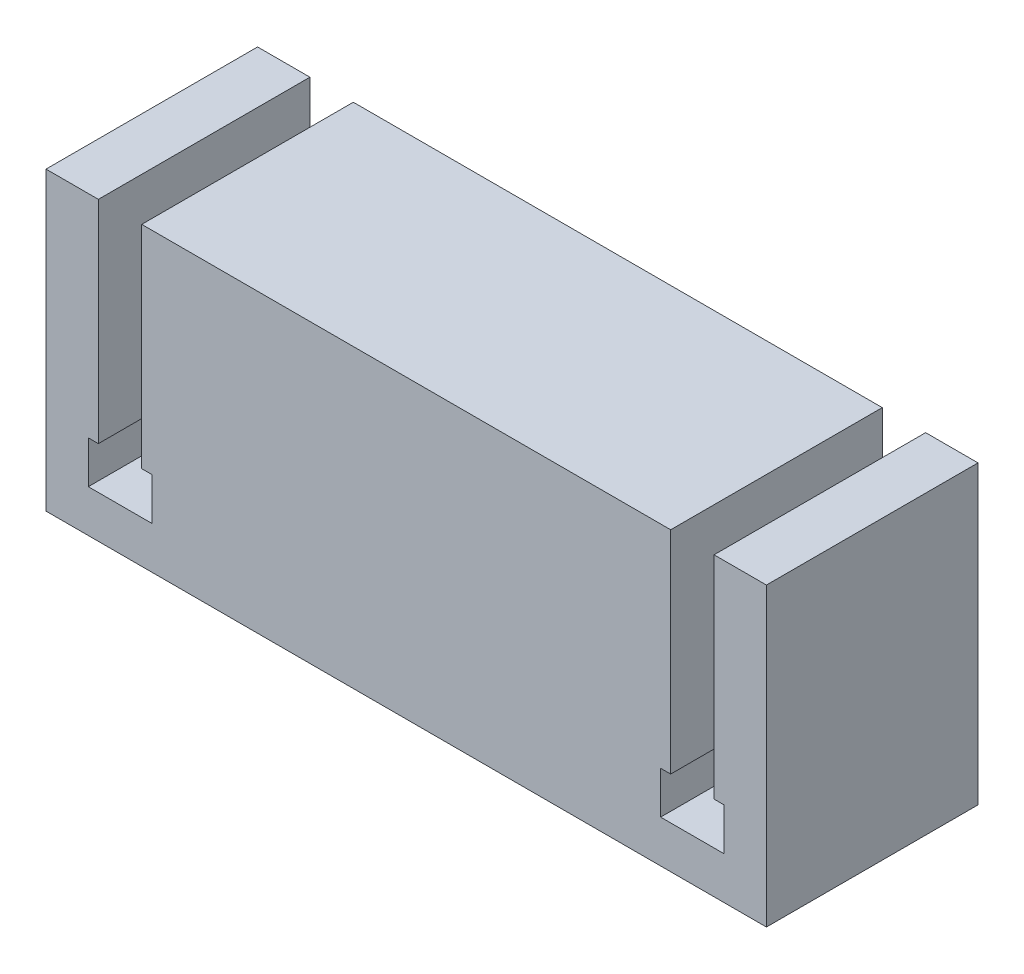
ISO-10303-21;
HEADER;
FILE_DESCRIPTION(('STEP AP214'),'2;1');
FILE_NAME('part.step','',(''),(''),'','','');
FILE_SCHEMA(('AUTOMOTIVE_DESIGN { 1 0 10303 214 1 1 1 1 }'));
ENDSEC;
DATA;
#1=APPLICATION_CONTEXT('core data for automotive mechanical design processes');
#2=APPLICATION_PROTOCOL_DEFINITION('international standard','automotive_design',2000,#1);
#3=PRODUCT_CONTEXT('',#1,'mechanical');
#4=PRODUCT('Part','Part','',(#3));
#5=PRODUCT_RELATED_PRODUCT_CATEGORY('part','',(#4));
#6=PRODUCT_DEFINITION_FORMATION('','',#4);
#7=PRODUCT_DEFINITION_CONTEXT('part definition',#1,'design');
#8=PRODUCT_DEFINITION('design','',#6,#7);
#9=PRODUCT_DEFINITION_SHAPE('','',#8);
#10=(LENGTH_UNIT() NAMED_UNIT(*) SI_UNIT(.MILLI.,.METRE.));
#11=(NAMED_UNIT(*) PLANE_ANGLE_UNIT() SI_UNIT($,.RADIAN.));
#12=(NAMED_UNIT(*) SI_UNIT($,.STERADIAN.) SOLID_ANGLE_UNIT());
#13=UNCERTAINTY_MEASURE_WITH_UNIT(LENGTH_MEASURE(1.E-05),#10,'distance_accuracy_value','');
#14=(GEOMETRIC_REPRESENTATION_CONTEXT(3) GLOBAL_UNCERTAINTY_ASSIGNED_CONTEXT((#13)) GLOBAL_UNIT_ASSIGNED_CONTEXT((#10,
#11,#12)) REPRESENTATION_CONTEXT('',''));
#15=CARTESIAN_POINT('',(0.,0.,0.));
#16=DIRECTION('',(0.,0.,1.));
#17=DIRECTION('',(1.,0.,0.));
#18=AXIS2_PLACEMENT_3D('',#15,#16,#17);
#19=CARTESIAN_POINT('',(85.125,35.,-25.));
#20=DIRECTION('',(1.,0.,0.));
#21=DIRECTION('',(0.,0.,-1.));
#22=AXIS2_PLACEMENT_3D('',#19,#20,#21);
#23=PLANE('',#22);
#24=DIRECTION('',(0.,0.,1.));
#25=VECTOR('',#24,1.);
#26=CARTESIAN_POINT('',(85.125,35.,-25.));
#27=LINE('',#26,#25);
#28=CARTESIAN_POINT('',(85.125,35.,-25.));
#29=VERTEX_POINT('',#28);
#30=CARTESIAN_POINT('',(85.125,35.,25.));
#31=VERTEX_POINT('',#30);
#32=EDGE_CURVE('E36',#29,#31,#27,.T.);
#33=ORIENTED_EDGE('',*,*,#32,.T.);
#34=DIRECTION('',(0.,1.,0.));
#35=VECTOR('',#34,1.);
#36=CARTESIAN_POINT('',(85.125,35.,25.));
#37=LINE('',#36,#35);
#38=CARTESIAN_POINT('',(85.125,-35.,25.));
#39=VERTEX_POINT('',#38);
#40=EDGE_CURVE('E169',#39,#31,#37,.T.);
#41=ORIENTED_EDGE('',*,*,#40,.F.);
#42=DIRECTION('',(0.,0.,1.));
#43=VECTOR('',#42,1.);
#44=CARTESIAN_POINT('',(85.125,-35.,-25.));
#45=LINE('',#44,#43);
#46=CARTESIAN_POINT('',(85.125,-35.,-25.));
#47=VERTEX_POINT('',#46);
#48=EDGE_CURVE('E11',#47,#39,#45,.T.);
#49=ORIENTED_EDGE('',*,*,#48,.F.);
#50=DIRECTION('',(0.,1.,0.));
#51=VECTOR('',#50,1.);
#52=CARTESIAN_POINT('',(85.125,35.,-25.));
#53=LINE('',#52,#51);
#54=EDGE_CURVE('E170',#47,#29,#53,.T.);
#55=ORIENTED_EDGE('',*,*,#54,.T.);
#56=EDGE_LOOP('',(#33,#41,#49,#55));
#57=FACE_BOUND('',#56,.T.);
#58=ADVANCED_FACE('F33',(#57),#23,.T.);
#59=CARTESIAN_POINT('',(85.125,-35.,-25.));
#60=DIRECTION('',(0.,-1.,0.));
#61=DIRECTION('',(0.,0.,-1.));
#62=AXIS2_PLACEMENT_3D('',#59,#60,#61);
#63=PLANE('',#62);
#64=ORIENTED_EDGE('',*,*,#48,.T.);
#65=DIRECTION('',(1.,0.,0.));
#66=VECTOR('',#65,1.);
#67=CARTESIAN_POINT('',(85.125,-35.,25.));
#68=LINE('',#67,#66);
#69=CARTESIAN_POINT('',(-85.125,-35.,25.));
#70=VERTEX_POINT('',#69);
#71=EDGE_CURVE('E187',#70,#39,#68,.T.);
#72=ORIENTED_EDGE('',*,*,#71,.F.);
#73=DIRECTION('',(0.,0.,1.));
#74=VECTOR('',#73,1.);
#75=CARTESIAN_POINT('',(-85.125,-35.,-25.));
#76=LINE('',#75,#74);
#77=CARTESIAN_POINT('',(-85.125,-35.,-25.));
#78=VERTEX_POINT('',#77);
#79=EDGE_CURVE('E41',#78,#70,#76,.T.);
#80=ORIENTED_EDGE('',*,*,#79,.F.);
#81=DIRECTION('',(1.,0.,0.));
#82=VECTOR('',#81,1.);
#83=CARTESIAN_POINT('',(85.125,-35.,-25.));
#84=LINE('',#83,#82);
#85=EDGE_CURVE('E175',#78,#47,#84,.T.);
#86=ORIENTED_EDGE('',*,*,#85,.T.);
#87=EDGE_LOOP('',(#64,#72,#80,#86));
#88=FACE_BOUND('',#87,.T.);
#89=ADVANCED_FACE('F395',(#88),#63,.T.);
#90=CARTESIAN_POINT('',(-85.125,-35.,-25.));
#91=DIRECTION('',(-1.,0.,0.));
#92=DIRECTION('',(0.,0.,1.));
#93=AXIS2_PLACEMENT_3D('',#90,#91,#92);
#94=PLANE('',#93);
#95=ORIENTED_EDGE('',*,*,#79,.T.);
#96=DIRECTION('',(0.,-1.,0.));
#97=VECTOR('',#96,1.);
#98=CARTESIAN_POINT('',(-85.125,-35.,25.));
#99=LINE('',#98,#97);
#100=CARTESIAN_POINT('',(-85.125,35.,25.));
#101=VERTEX_POINT('',#100);
#102=EDGE_CURVE('E236',#101,#70,#99,.T.);
#103=ORIENTED_EDGE('',*,*,#102,.F.);
#104=DIRECTION('',(0.,0.,1.));
#105=VECTOR('',#104,1.);
#106=CARTESIAN_POINT('',(-85.125,35.,-25.));
#107=LINE('',#106,#105);
#108=CARTESIAN_POINT('',(-85.125,35.,-25.));
#109=VERTEX_POINT('',#108);
#110=EDGE_CURVE('E294',#109,#101,#107,.T.);
#111=ORIENTED_EDGE('',*,*,#110,.F.);
#112=DIRECTION('',(0.,-1.,0.));
#113=VECTOR('',#112,1.);
#114=CARTESIAN_POINT('',(-85.125,-35.,-25.));
#115=LINE('',#114,#113);
#116=EDGE_CURVE('E290',#109,#78,#115,.T.);
#117=ORIENTED_EDGE('',*,*,#116,.T.);
#118=EDGE_LOOP('',(#95,#103,#111,#117));
#119=FACE_BOUND('',#118,.T.);
#120=ADVANCED_FACE('F394',(#119),#94,.T.);
#121=CARTESIAN_POINT('',(-85.125,35.,-25.));
#122=DIRECTION('',(0.,1.,0.));
#123=DIRECTION('',(-1.,0.,0.));
#124=AXIS2_PLACEMENT_3D('',#121,#122,#123);
#125=PLANE('',#124);
#126=ORIENTED_EDGE('',*,*,#110,.T.);
#127=DIRECTION('',(-1.,0.,0.));
#128=VECTOR('',#127,1.);
#129=CARTESIAN_POINT('',(-85.125,35.,25.));
#130=LINE('',#129,#128);
#131=CARTESIAN_POINT('',(-72.75,35.,25.));
#132=VERTEX_POINT('',#131);
#133=EDGE_CURVE('E233',#132,#101,#130,.T.);
#134=ORIENTED_EDGE('',*,*,#133,.F.);
#135=DIRECTION('',(0.,0.,1.));
#136=VECTOR('',#135,1.);
#137=CARTESIAN_POINT('',(-72.75,35.,-25.));
#138=LINE('',#137,#136);
#139=CARTESIAN_POINT('',(-72.75,35.,-25.));
#140=VERTEX_POINT('',#139);
#141=EDGE_CURVE('E296',#140,#132,#138,.T.);
#142=ORIENTED_EDGE('',*,*,#141,.F.);
#143=DIRECTION('',(-1.,0.,0.));
#144=VECTOR('',#143,1.);
#145=CARTESIAN_POINT('',(-85.125,35.,-25.));
#146=LINE('',#145,#144);
#147=EDGE_CURVE('E287',#140,#109,#146,.T.);
#148=ORIENTED_EDGE('',*,*,#147,.T.);
#149=EDGE_LOOP('',(#126,#134,#142,#148));
#150=FACE_BOUND('',#149,.T.);
#151=ADVANCED_FACE('F390',(#150),#125,.T.);
#152=CARTESIAN_POINT('',(-72.75,35.,-25.));
#153=DIRECTION('',(1.,0.,0.));
#154=DIRECTION('',(0.,0.,-1.));
#155=AXIS2_PLACEMENT_3D('',#152,#153,#154);
#156=PLANE('',#155);
#157=ORIENTED_EDGE('',*,*,#141,.T.);
#158=DIRECTION('',(0.,1.,0.));
#159=VECTOR('',#158,1.);
#160=CARTESIAN_POINT('',(-72.75,35.,25.));
#161=LINE('',#160,#159);
#162=CARTESIAN_POINT('',(-72.75,-15.,25.));
#163=VERTEX_POINT('',#162);
#164=EDGE_CURVE('E230',#163,#132,#161,.T.);
#165=ORIENTED_EDGE('',*,*,#164,.F.);
#166=DIRECTION('',(0.,0.,1.));
#167=VECTOR('',#166,1.);
#168=CARTESIAN_POINT('',(-72.75,-15.,-25.));
#169=LINE('',#168,#167);
#170=CARTESIAN_POINT('',(-72.75,-15.,-25.));
#171=VERTEX_POINT('',#170);
#172=EDGE_CURVE('E298',#171,#163,#169,.T.);
#173=ORIENTED_EDGE('',*,*,#172,.F.);
#174=DIRECTION('',(0.,1.,0.));
#175=VECTOR('',#174,1.);
#176=CARTESIAN_POINT('',(-72.75,35.,-25.));
#177=LINE('',#176,#175);
#178=EDGE_CURVE('E284',#171,#140,#177,.T.);
#179=ORIENTED_EDGE('',*,*,#178,.T.);
#180=EDGE_LOOP('',(#157,#165,#173,#179));
#181=FACE_BOUND('',#180,.T.);
#182=ADVANCED_FACE('F385',(#181),#156,.T.);
#183=CARTESIAN_POINT('',(-72.75,-15.,-25.));
#184=DIRECTION('',(0.,-1.,0.));
#185=DIRECTION('',(0.,0.,-1.));
#186=AXIS2_PLACEMENT_3D('',#183,#184,#185);
#187=PLANE('',#186);
#188=ORIENTED_EDGE('',*,*,#172,.T.);
#189=DIRECTION('',(1.,0.,0.));
#190=VECTOR('',#189,1.);
#191=CARTESIAN_POINT('',(-72.75,-15.,25.));
#192=LINE('',#191,#190);
#193=CARTESIAN_POINT('',(-75.125,-15.,25.));
#194=VERTEX_POINT('',#193);
#195=EDGE_CURVE('E227',#194,#163,#192,.T.);
#196=ORIENTED_EDGE('',*,*,#195,.F.);
#197=DIRECTION('',(0.,0.,1.));
#198=VECTOR('',#197,1.);
#199=CARTESIAN_POINT('',(-75.125,-15.,-25.));
#200=LINE('',#199,#198);
#201=CARTESIAN_POINT('',(-75.125,-15.,-25.));
#202=VERTEX_POINT('',#201);
#203=EDGE_CURVE('E300',#202,#194,#200,.T.);
#204=ORIENTED_EDGE('',*,*,#203,.F.);
#205=DIRECTION('',(1.,0.,0.));
#206=VECTOR('',#205,1.);
#207=CARTESIAN_POINT('',(-72.75,-15.,-25.));
#208=LINE('',#207,#206);
#209=EDGE_CURVE('E281',#202,#171,#208,.T.);
#210=ORIENTED_EDGE('',*,*,#209,.T.);
#211=EDGE_LOOP('',(#188,#196,#204,#210));
#212=FACE_BOUND('',#211,.T.);
#213=ADVANCED_FACE('F383',(#212),#187,.T.);
#214=CARTESIAN_POINT('',(-75.125,-15.,-25.));
#215=DIRECTION('',(1.,0.,0.));
#216=DIRECTION('',(0.,0.,-1.));
#217=AXIS2_PLACEMENT_3D('',#214,#215,#216);
#218=PLANE('',#217);
#219=ORIENTED_EDGE('',*,*,#203,.T.);
#220=DIRECTION('',(0.,1.,0.));
#221=VECTOR('',#220,1.);
#222=CARTESIAN_POINT('',(-75.125,-15.,25.));
#223=LINE('',#222,#221);
#224=CARTESIAN_POINT('',(-75.125,-25.,25.));
#225=VERTEX_POINT('',#224);
#226=EDGE_CURVE('E224',#225,#194,#223,.T.);
#227=ORIENTED_EDGE('',*,*,#226,.F.);
#228=DIRECTION('',(0.,0.,1.));
#229=VECTOR('',#228,1.);
#230=CARTESIAN_POINT('',(-75.125,-25.,-25.));
#231=LINE('',#230,#229);
#232=CARTESIAN_POINT('',(-75.125,-25.,-25.));
#233=VERTEX_POINT('',#232);
#234=EDGE_CURVE('E302',#233,#225,#231,.T.);
#235=ORIENTED_EDGE('',*,*,#234,.F.);
#236=DIRECTION('',(0.,1.,0.));
#237=VECTOR('',#236,1.);
#238=CARTESIAN_POINT('',(-75.125,-15.,-25.));
#239=LINE('',#238,#237);
#240=EDGE_CURVE('E278',#233,#202,#239,.T.);
#241=ORIENTED_EDGE('',*,*,#240,.T.);
#242=EDGE_LOOP('',(#219,#227,#235,#241));
#243=FACE_BOUND('',#242,.T.);
#244=ADVANCED_FACE('F378',(#243),#218,.T.);
#245=CARTESIAN_POINT('',(-75.125,-25.,-25.));
#246=DIRECTION('',(0.,1.,0.));
#247=DIRECTION('',(0.,0.,1.));
#248=AXIS2_PLACEMENT_3D('',#245,#246,#247);
#249=PLANE('',#248);
#250=ORIENTED_EDGE('',*,*,#234,.T.);
#251=DIRECTION('',(-1.,0.,0.));
#252=VECTOR('',#251,1.);
#253=CARTESIAN_POINT('',(-75.125,-25.,25.));
#254=LINE('',#253,#252);
#255=CARTESIAN_POINT('',(-60.125,-25.,25.));
#256=VERTEX_POINT('',#255);
#257=EDGE_CURVE('E221',#256,#225,#254,.T.);
#258=ORIENTED_EDGE('',*,*,#257,.F.);
#259=DIRECTION('',(0.,0.,1.));
#260=VECTOR('',#259,1.);
#261=CARTESIAN_POINT('',(-60.125,-25.,-25.));
#262=LINE('',#261,#260);
#263=CARTESIAN_POINT('',(-60.125,-25.,-25.));
#264=VERTEX_POINT('',#263);
#265=EDGE_CURVE('E304',#264,#256,#262,.T.);
#266=ORIENTED_EDGE('',*,*,#265,.F.);
#267=DIRECTION('',(-1.,0.,0.));
#268=VECTOR('',#267,1.);
#269=CARTESIAN_POINT('',(-75.125,-25.,-25.));
#270=LINE('',#269,#268);
#271=EDGE_CURVE('E275',#264,#233,#270,.T.);
#272=ORIENTED_EDGE('',*,*,#271,.T.);
#273=EDGE_LOOP('',(#250,#258,#266,#272));
#274=FACE_BOUND('',#273,.T.);
#275=ADVANCED_FACE('F373',(#274),#249,.T.);
#276=CARTESIAN_POINT('',(-60.125,-25.,-25.));
#277=DIRECTION('',(-1.,0.,0.));
#278=DIRECTION('',(0.,-1.,0.));
#279=AXIS2_PLACEMENT_3D('',#276,#277,#278);
#280=PLANE('',#279);
#281=ORIENTED_EDGE('',*,*,#265,.T.);
#282=DIRECTION('',(0.,-1.,0.));
#283=VECTOR('',#282,1.);
#284=CARTESIAN_POINT('',(-60.125,-25.,25.));
#285=LINE('',#284,#283);
#286=CARTESIAN_POINT('',(-60.125,-15.,25.));
#287=VERTEX_POINT('',#286);
#288=EDGE_CURVE('E218',#287,#256,#285,.T.);
#289=ORIENTED_EDGE('',*,*,#288,.F.);
#290=DIRECTION('',(0.,0.,1.));
#291=VECTOR('',#290,1.);
#292=CARTESIAN_POINT('',(-60.125,-15.,-25.));
#293=LINE('',#292,#291);
#294=CARTESIAN_POINT('',(-60.125,-15.,-25.));
#295=VERTEX_POINT('',#294);
#296=EDGE_CURVE('E306',#295,#287,#293,.T.);
#297=ORIENTED_EDGE('',*,*,#296,.F.);
#298=DIRECTION('',(0.,-1.,0.));
#299=VECTOR('',#298,1.);
#300=CARTESIAN_POINT('',(-60.125,-25.,-25.));
#301=LINE('',#300,#299);
#302=EDGE_CURVE('E272',#295,#264,#301,.T.);
#303=ORIENTED_EDGE('',*,*,#302,.T.);
#304=EDGE_LOOP('',(#281,#289,#297,#303));
#305=FACE_BOUND('',#304,.T.);
#306=ADVANCED_FACE('F371',(#305),#280,.T.);
#307=CARTESIAN_POINT('',(-60.125,-15.,-25.));
#308=DIRECTION('',(0.,-1.,0.));
#309=DIRECTION('',(0.,0.,-1.));
#310=AXIS2_PLACEMENT_3D('',#307,#308,#309);
#311=PLANE('',#310);
#312=ORIENTED_EDGE('',*,*,#296,.T.);
#313=DIRECTION('',(1.,0.,0.));
#314=VECTOR('',#313,1.);
#315=CARTESIAN_POINT('',(-60.125,-15.,25.));
#316=LINE('',#315,#314);
#317=CARTESIAN_POINT('',(-62.5,-15.,25.));
#318=VERTEX_POINT('',#317);
#319=EDGE_CURVE('E215',#318,#287,#316,.T.);
#320=ORIENTED_EDGE('',*,*,#319,.F.);
#321=DIRECTION('',(0.,0.,1.));
#322=VECTOR('',#321,1.);
#323=CARTESIAN_POINT('',(-62.5,-15.,-25.));
#324=LINE('',#323,#322);
#325=CARTESIAN_POINT('',(-62.5,-15.,-25.));
#326=VERTEX_POINT('',#325);
#327=EDGE_CURVE('E308',#326,#318,#324,.T.);
#328=ORIENTED_EDGE('',*,*,#327,.F.);
#329=DIRECTION('',(1.,0.,0.));
#330=VECTOR('',#329,1.);
#331=CARTESIAN_POINT('',(-60.125,-15.,-25.));
#332=LINE('',#331,#330);
#333=EDGE_CURVE('E269',#326,#295,#332,.T.);
#334=ORIENTED_EDGE('',*,*,#333,.T.);
#335=EDGE_LOOP('',(#312,#320,#328,#334));
#336=FACE_BOUND('',#335,.T.);
#337=ADVANCED_FACE('F366',(#336),#311,.T.);
#338=CARTESIAN_POINT('',(-62.5,-15.,-25.));
#339=DIRECTION('',(-1.,0.,0.));
#340=DIRECTION('',(0.,0.,1.));
#341=AXIS2_PLACEMENT_3D('',#338,#339,#340);
#342=PLANE('',#341);
#343=ORIENTED_EDGE('',*,*,#327,.T.);
#344=DIRECTION('',(0.,-1.,0.));
#345=VECTOR('',#344,1.);
#346=CARTESIAN_POINT('',(-62.5,-15.,25.));
#347=LINE('',#346,#345);
#348=CARTESIAN_POINT('',(-62.5,35.,25.));
#349=VERTEX_POINT('',#348);
#350=EDGE_CURVE('E212',#349,#318,#347,.T.);
#351=ORIENTED_EDGE('',*,*,#350,.F.);
#352=DIRECTION('',(0.,0.,1.));
#353=VECTOR('',#352,1.);
#354=CARTESIAN_POINT('',(-62.5,35.,-25.));
#355=LINE('',#354,#353);
#356=CARTESIAN_POINT('',(-62.5,35.,-25.));
#357=VERTEX_POINT('',#356);
#358=EDGE_CURVE('E310',#357,#349,#355,.T.);
#359=ORIENTED_EDGE('',*,*,#358,.F.);
#360=DIRECTION('',(0.,-1.,0.));
#361=VECTOR('',#360,1.);
#362=CARTESIAN_POINT('',(-62.5,-15.,-25.));
#363=LINE('',#362,#361);
#364=EDGE_CURVE('E266',#357,#326,#363,.T.);
#365=ORIENTED_EDGE('',*,*,#364,.T.);
#366=EDGE_LOOP('',(#343,#351,#359,#365));
#367=FACE_BOUND('',#366,.T.);
#368=ADVANCED_FACE('F361',(#367),#342,.T.);
#369=CARTESIAN_POINT('',(-62.5,35.,-25.));
#370=DIRECTION('',(0.,1.,0.));
#371=DIRECTION('',(0.,0.,1.));
#372=AXIS2_PLACEMENT_3D('',#369,#370,#371);
#373=PLANE('',#372);
#374=ORIENTED_EDGE('',*,*,#358,.T.);
#375=DIRECTION('',(-1.,0.,0.));
#376=VECTOR('',#375,1.);
#377=CARTESIAN_POINT('',(-62.5,35.,25.));
#378=LINE('',#377,#376);
#379=CARTESIAN_POINT('',(62.5,35.,25.));
#380=VERTEX_POINT('',#379);
#381=EDGE_CURVE('E209',#380,#349,#378,.T.);
#382=ORIENTED_EDGE('',*,*,#381,.F.);
#383=DIRECTION('',(0.,0.,1.));
#384=VECTOR('',#383,1.);
#385=CARTESIAN_POINT('',(62.5,35.,-25.));
#386=LINE('',#385,#384);
#387=CARTESIAN_POINT('',(62.5,35.,-25.));
#388=VERTEX_POINT('',#387);
#389=EDGE_CURVE('E312',#388,#380,#386,.T.);
#390=ORIENTED_EDGE('',*,*,#389,.F.);
#391=DIRECTION('',(-1.,0.,0.));
#392=VECTOR('',#391,1.);
#393=CARTESIAN_POINT('',(-62.5,35.,-25.));
#394=LINE('',#393,#392);
#395=EDGE_CURVE('E263',#388,#357,#394,.T.);
#396=ORIENTED_EDGE('',*,*,#395,.T.);
#397=EDGE_LOOP('',(#374,#382,#390,#396));
#398=FACE_BOUND('',#397,.T.);
#399=ADVANCED_FACE('F359',(#398),#373,.T.);
#400=CARTESIAN_POINT('',(62.5,35.,-25.));
#401=DIRECTION('',(1.,0.,0.));
#402=DIRECTION('',(0.,0.,-1.));
#403=AXIS2_PLACEMENT_3D('',#400,#401,#402);
#404=PLANE('',#403);
#405=ORIENTED_EDGE('',*,*,#389,.T.);
#406=DIRECTION('',(0.,1.,0.));
#407=VECTOR('',#406,1.);
#408=CARTESIAN_POINT('',(62.5,35.,25.));
#409=LINE('',#408,#407);
#410=CARTESIAN_POINT('',(62.5,-15.,25.));
#411=VERTEX_POINT('',#410);
#412=EDGE_CURVE('E206',#411,#380,#409,.T.);
#413=ORIENTED_EDGE('',*,*,#412,.F.);
#414=DIRECTION('',(0.,0.,1.));
#415=VECTOR('',#414,1.);
#416=CARTESIAN_POINT('',(62.5,-15.,-25.));
#417=LINE('',#416,#415);
#418=CARTESIAN_POINT('',(62.5,-15.,-25.));
#419=VERTEX_POINT('',#418);
#420=EDGE_CURVE('E314',#419,#411,#417,.T.);
#421=ORIENTED_EDGE('',*,*,#420,.F.);
#422=DIRECTION('',(0.,1.,0.));
#423=VECTOR('',#422,1.);
#424=CARTESIAN_POINT('',(62.5,35.,-25.));
#425=LINE('',#424,#423);
#426=EDGE_CURVE('E260',#419,#388,#425,.T.);
#427=ORIENTED_EDGE('',*,*,#426,.T.);
#428=EDGE_LOOP('',(#405,#413,#421,#427));
#429=FACE_BOUND('',#428,.T.);
#430=ADVANCED_FACE('F354',(#429),#404,.T.);
#431=CARTESIAN_POINT('',(62.5,-15.,-25.));
#432=DIRECTION('',(0.,-1.,0.));
#433=DIRECTION('',(0.,0.,-1.));
#434=AXIS2_PLACEMENT_3D('',#431,#432,#433);
#435=PLANE('',#434);
#436=ORIENTED_EDGE('',*,*,#420,.T.);
#437=DIRECTION('',(1.,0.,0.));
#438=VECTOR('',#437,1.);
#439=CARTESIAN_POINT('',(62.5,-15.,25.));
#440=LINE('',#439,#438);
#441=CARTESIAN_POINT('',(60.125,-15.,25.));
#442=VERTEX_POINT('',#441);
#443=EDGE_CURVE('E203',#442,#411,#440,.T.);
#444=ORIENTED_EDGE('',*,*,#443,.F.);
#445=DIRECTION('',(0.,0.,1.));
#446=VECTOR('',#445,1.);
#447=CARTESIAN_POINT('',(60.125,-15.,-25.));
#448=LINE('',#447,#446);
#449=CARTESIAN_POINT('',(60.125,-15.,-25.));
#450=VERTEX_POINT('',#449);
#451=EDGE_CURVE('E316',#450,#442,#448,.T.);
#452=ORIENTED_EDGE('',*,*,#451,.F.);
#453=DIRECTION('',(1.,0.,0.));
#454=VECTOR('',#453,1.);
#455=CARTESIAN_POINT('',(62.5,-15.,-25.));
#456=LINE('',#455,#454);
#457=EDGE_CURVE('E257',#450,#419,#456,.T.);
#458=ORIENTED_EDGE('',*,*,#457,.T.);
#459=EDGE_LOOP('',(#436,#444,#452,#458));
#460=FACE_BOUND('',#459,.T.);
#461=ADVANCED_FACE('F349',(#460),#435,.T.);
#462=CARTESIAN_POINT('',(60.125,-15.,-25.));
#463=DIRECTION('',(1.,0.,0.));
#464=DIRECTION('',(0.,1.,0.));
#465=AXIS2_PLACEMENT_3D('',#462,#463,#464);
#466=PLANE('',#465);
#467=ORIENTED_EDGE('',*,*,#451,.T.);
#468=DIRECTION('',(0.,1.,0.));
#469=VECTOR('',#468,1.);
#470=CARTESIAN_POINT('',(60.125,-15.,25.));
#471=LINE('',#470,#469);
#472=CARTESIAN_POINT('',(60.125,-25.,25.));
#473=VERTEX_POINT('',#472);
#474=EDGE_CURVE('E200',#473,#442,#471,.T.);
#475=ORIENTED_EDGE('',*,*,#474,.F.);
#476=DIRECTION('',(0.,0.,1.));
#477=VECTOR('',#476,1.);
#478=CARTESIAN_POINT('',(60.125,-25.,-25.));
#479=LINE('',#478,#477);
#480=CARTESIAN_POINT('',(60.125,-25.,-25.));
#481=VERTEX_POINT('',#480);
#482=EDGE_CURVE('E318',#481,#473,#479,.T.);
#483=ORIENTED_EDGE('',*,*,#482,.F.);
#484=DIRECTION('',(0.,1.,0.));
#485=VECTOR('',#484,1.);
#486=CARTESIAN_POINT('',(60.125,-15.,-25.));
#487=LINE('',#486,#485);
#488=EDGE_CURVE('E254',#481,#450,#487,.T.);
#489=ORIENTED_EDGE('',*,*,#488,.T.);
#490=EDGE_LOOP('',(#467,#475,#483,#489));
#491=FACE_BOUND('',#490,.T.);
#492=ADVANCED_FACE('F347',(#491),#466,.T.);
#493=CARTESIAN_POINT('',(60.125,-25.,-25.));
#494=DIRECTION('',(0.,1.,0.));
#495=DIRECTION('',(0.,0.,1.));
#496=AXIS2_PLACEMENT_3D('',#493,#494,#495);
#497=PLANE('',#496);
#498=ORIENTED_EDGE('',*,*,#482,.T.);
#499=DIRECTION('',(-1.,0.,0.));
#500=VECTOR('',#499,1.);
#501=CARTESIAN_POINT('',(60.125,-25.,25.));
#502=LINE('',#501,#500);
#503=CARTESIAN_POINT('',(75.125,-25.,25.));
#504=VERTEX_POINT('',#503);
#505=EDGE_CURVE('E197',#504,#473,#502,.T.);
#506=ORIENTED_EDGE('',*,*,#505,.F.);
#507=DIRECTION('',(0.,0.,1.));
#508=VECTOR('',#507,1.);
#509=CARTESIAN_POINT('',(75.125,-25.,-25.));
#510=LINE('',#509,#508);
#511=CARTESIAN_POINT('',(75.125,-25.,-25.));
#512=VERTEX_POINT('',#511);
#513=EDGE_CURVE('E320',#512,#504,#510,.T.);
#514=ORIENTED_EDGE('',*,*,#513,.F.);
#515=DIRECTION('',(-1.,0.,0.));
#516=VECTOR('',#515,1.);
#517=CARTESIAN_POINT('',(60.125,-25.,-25.));
#518=LINE('',#517,#516);
#519=EDGE_CURVE('E251',#512,#481,#518,.T.);
#520=ORIENTED_EDGE('',*,*,#519,.T.);
#521=EDGE_LOOP('',(#498,#506,#514,#520));
#522=FACE_BOUND('',#521,.T.);
#523=ADVANCED_FACE('F342',(#522),#497,.T.);
#524=CARTESIAN_POINT('',(75.125,-25.,-25.));
#525=DIRECTION('',(-1.,0.,0.));
#526=DIRECTION('',(0.,0.,1.));
#527=AXIS2_PLACEMENT_3D('',#524,#525,#526);
#528=PLANE('',#527);
#529=ORIENTED_EDGE('',*,*,#513,.T.);
#530=DIRECTION('',(0.,-1.,0.));
#531=VECTOR('',#530,1.);
#532=CARTESIAN_POINT('',(75.125,-25.,25.));
#533=LINE('',#532,#531);
#534=CARTESIAN_POINT('',(75.125,-15.,25.));
#535=VERTEX_POINT('',#534);
#536=EDGE_CURVE('E194',#535,#504,#533,.T.);
#537=ORIENTED_EDGE('',*,*,#536,.F.);
#538=DIRECTION('',(0.,0.,1.));
#539=VECTOR('',#538,1.);
#540=CARTESIAN_POINT('',(75.125,-15.,-25.));
#541=LINE('',#540,#539);
#542=CARTESIAN_POINT('',(75.125,-15.,-25.));
#543=VERTEX_POINT('',#542);
#544=EDGE_CURVE('E322',#543,#535,#541,.T.);
#545=ORIENTED_EDGE('',*,*,#544,.F.);
#546=DIRECTION('',(0.,-1.,0.));
#547=VECTOR('',#546,1.);
#548=CARTESIAN_POINT('',(75.125,-25.,-25.));
#549=LINE('',#548,#547);
#550=EDGE_CURVE('E248',#543,#512,#549,.T.);
#551=ORIENTED_EDGE('',*,*,#550,.T.);
#552=EDGE_LOOP('',(#529,#537,#545,#551));
#553=FACE_BOUND('',#552,.T.);
#554=ADVANCED_FACE('F335',(#553),#528,.T.);
#555=CARTESIAN_POINT('',(75.125,-15.,-25.));
#556=DIRECTION('',(0.,-1.,0.));
#557=DIRECTION('',(0.,0.,-1.));
#558=AXIS2_PLACEMENT_3D('',#555,#556,#557);
#559=PLANE('',#558);
#560=ORIENTED_EDGE('',*,*,#544,.T.);
#561=DIRECTION('',(1.,0.,0.));
#562=VECTOR('',#561,1.);
#563=CARTESIAN_POINT('',(75.125,-15.,25.));
#564=LINE('',#563,#562);
#565=CARTESIAN_POINT('',(72.75,-15.,25.));
#566=VERTEX_POINT('',#565);
#567=EDGE_CURVE('E191',#566,#535,#564,.T.);
#568=ORIENTED_EDGE('',*,*,#567,.F.);
#569=DIRECTION('',(0.,0.,1.));
#570=VECTOR('',#569,1.);
#571=CARTESIAN_POINT('',(72.75,-15.,-25.));
#572=LINE('',#571,#570);
#573=CARTESIAN_POINT('',(72.75,-15.,-25.));
#574=VERTEX_POINT('',#573);
#575=EDGE_CURVE('E324',#574,#566,#572,.T.);
#576=ORIENTED_EDGE('',*,*,#575,.F.);
#577=DIRECTION('',(1.,0.,0.));
#578=VECTOR('',#577,1.);
#579=CARTESIAN_POINT('',(75.125,-15.,-25.));
#580=LINE('',#579,#578);
#581=EDGE_CURVE('E245',#574,#543,#580,.T.);
#582=ORIENTED_EDGE('',*,*,#581,.T.);
#583=EDGE_LOOP('',(#560,#568,#576,#582));
#584=FACE_BOUND('',#583,.T.);
#585=ADVANCED_FACE('F332',(#584),#559,.T.);
#586=CARTESIAN_POINT('',(72.75,-15.,-25.));
#587=DIRECTION('',(-1.,0.,0.));
#588=DIRECTION('',(0.,0.,1.));
#589=AXIS2_PLACEMENT_3D('',#586,#587,#588);
#590=PLANE('',#589);
#591=ORIENTED_EDGE('',*,*,#575,.T.);
#592=DIRECTION('',(0.,-1.,0.));
#593=VECTOR('',#592,1.);
#594=CARTESIAN_POINT('',(72.75,-15.,25.));
#595=LINE('',#594,#593);
#596=CARTESIAN_POINT('',(72.75,35.,25.));
#597=VERTEX_POINT('',#596);
#598=EDGE_CURVE('E182',#597,#566,#595,.T.);
#599=ORIENTED_EDGE('',*,*,#598,.F.);
#600=DIRECTION('',(0.,0.,1.));
#601=VECTOR('',#600,1.);
#602=CARTESIAN_POINT('',(72.75,35.,-25.));
#603=LINE('',#602,#601);
#604=CARTESIAN_POINT('',(72.75,35.,-25.));
#605=VERTEX_POINT('',#604);
#606=EDGE_CURVE('E174',#605,#597,#603,.T.);
#607=ORIENTED_EDGE('',*,*,#606,.F.);
#608=DIRECTION('',(0.,-1.,0.));
#609=VECTOR('',#608,1.);
#610=CARTESIAN_POINT('',(72.75,-15.,-25.));
#611=LINE('',#610,#609);
#612=EDGE_CURVE('E242',#605,#574,#611,.T.);
#613=ORIENTED_EDGE('',*,*,#612,.T.);
#614=EDGE_LOOP('',(#591,#599,#607,#613));
#615=FACE_BOUND('',#614,.T.);
#616=ADVANCED_FACE('F326',(#615),#590,.T.);
#617=CARTESIAN_POINT('',(72.75,35.,-25.));
#618=DIRECTION('',(0.,1.,0.));
#619=DIRECTION('',(-1.,0.,0.));
#620=AXIS2_PLACEMENT_3D('',#617,#618,#619);
#621=PLANE('',#620);
#622=ORIENTED_EDGE('',*,*,#606,.T.);
#623=DIRECTION('',(-1.,0.,0.));
#624=VECTOR('',#623,1.);
#625=CARTESIAN_POINT('',(72.75,35.,25.));
#626=LINE('',#625,#624);
#627=EDGE_CURVE('E177',#31,#597,#626,.T.);
#628=ORIENTED_EDGE('',*,*,#627,.F.);
#629=ORIENTED_EDGE('',*,*,#32,.F.);
#630=DIRECTION('',(-1.,0.,0.));
#631=VECTOR('',#630,1.);
#632=CARTESIAN_POINT('',(72.75,35.,-25.));
#633=LINE('',#632,#631);
#634=EDGE_CURVE('E240',#29,#605,#633,.T.);
#635=ORIENTED_EDGE('',*,*,#634,.T.);
#636=EDGE_LOOP('',(#622,#628,#629,#635));
#637=FACE_BOUND('',#636,.T.);
#638=ADVANCED_FACE('F178',(#637),#621,.T.);
#639=CARTESIAN_POINT('',(0.,0.,-25.));
#640=DIRECTION('',(0.,0.,-1.));
#641=DIRECTION('',(-1.,0.,0.));
#642=AXIS2_PLACEMENT_3D('',#639,#640,#641);
#643=PLANE('',#642);
#644=ORIENTED_EDGE('',*,*,#54,.F.);
#645=ORIENTED_EDGE('',*,*,#85,.F.);
#646=ORIENTED_EDGE('',*,*,#116,.F.);
#647=ORIENTED_EDGE('',*,*,#147,.F.);
#648=ORIENTED_EDGE('',*,*,#178,.F.);
#649=ORIENTED_EDGE('',*,*,#209,.F.);
#650=ORIENTED_EDGE('',*,*,#240,.F.);
#651=ORIENTED_EDGE('',*,*,#271,.F.);
#652=ORIENTED_EDGE('',*,*,#302,.F.);
#653=ORIENTED_EDGE('',*,*,#333,.F.);
#654=ORIENTED_EDGE('',*,*,#364,.F.);
#655=ORIENTED_EDGE('',*,*,#395,.F.);
#656=ORIENTED_EDGE('',*,*,#426,.F.);
#657=ORIENTED_EDGE('',*,*,#457,.F.);
#658=ORIENTED_EDGE('',*,*,#488,.F.);
#659=ORIENTED_EDGE('',*,*,#519,.F.);
#660=ORIENTED_EDGE('',*,*,#550,.F.);
#661=ORIENTED_EDGE('',*,*,#581,.F.);
#662=ORIENTED_EDGE('',*,*,#612,.F.);
#663=ORIENTED_EDGE('',*,*,#634,.F.);
#664=EDGE_LOOP('',(#644,#645,#646,#647,#648,#649,#650,#651,#652,#653,#654,#655,#656,#657,#658,
#659,#660,#661,#662,#663));
#665=FACE_BOUND('',#664,.T.);
#666=ADVANCED_FACE('F338',(#665),#643,.T.);
#667=CARTESIAN_POINT('',(0.,0.,25.));
#668=DIRECTION('',(0.,0.,-1.));
#669=DIRECTION('',(-1.,0.,0.));
#670=AXIS2_PLACEMENT_3D('',#667,#668,#669);
#671=PLANE('',#670);
#672=ORIENTED_EDGE('',*,*,#40,.T.);
#673=ORIENTED_EDGE('',*,*,#627,.T.);
#674=ORIENTED_EDGE('',*,*,#598,.T.);
#675=ORIENTED_EDGE('',*,*,#567,.T.);
#676=ORIENTED_EDGE('',*,*,#536,.T.);
#677=ORIENTED_EDGE('',*,*,#505,.T.);
#678=ORIENTED_EDGE('',*,*,#474,.T.);
#679=ORIENTED_EDGE('',*,*,#443,.T.);
#680=ORIENTED_EDGE('',*,*,#412,.T.);
#681=ORIENTED_EDGE('',*,*,#381,.T.);
#682=ORIENTED_EDGE('',*,*,#350,.T.);
#683=ORIENTED_EDGE('',*,*,#319,.T.);
#684=ORIENTED_EDGE('',*,*,#288,.T.);
#685=ORIENTED_EDGE('',*,*,#257,.T.);
#686=ORIENTED_EDGE('',*,*,#226,.T.);
#687=ORIENTED_EDGE('',*,*,#195,.T.);
#688=ORIENTED_EDGE('',*,*,#164,.T.);
#689=ORIENTED_EDGE('',*,*,#133,.T.);
#690=ORIENTED_EDGE('',*,*,#102,.T.);
#691=ORIENTED_EDGE('',*,*,#71,.T.);
#692=EDGE_LOOP('',(#672,#673,#674,#675,#676,#677,#678,#679,#680,#681,#682,#683,#684,#685,#686,
#687,#688,#689,#690,#691));
#693=FACE_BOUND('',#692,.T.);
#694=ADVANCED_FACE('F185',(#693),#671,.F.);
#695=CLOSED_SHELL('',(#58,#89,#120,#151,#182,#213,#244,#275,#306,#337,#368,#399,#430,#461,#492,
#523,#554,#585,#616,#638,#666,#694));
#696=MANIFOLD_SOLID_BREP('B2',#695);
#697=ADVANCED_BREP_SHAPE_REPRESENTATION('',(#18,#696),#14);
#698=SHAPE_DEFINITION_REPRESENTATION(#9,#697);
ENDSEC;
END-ISO-10303-21;
